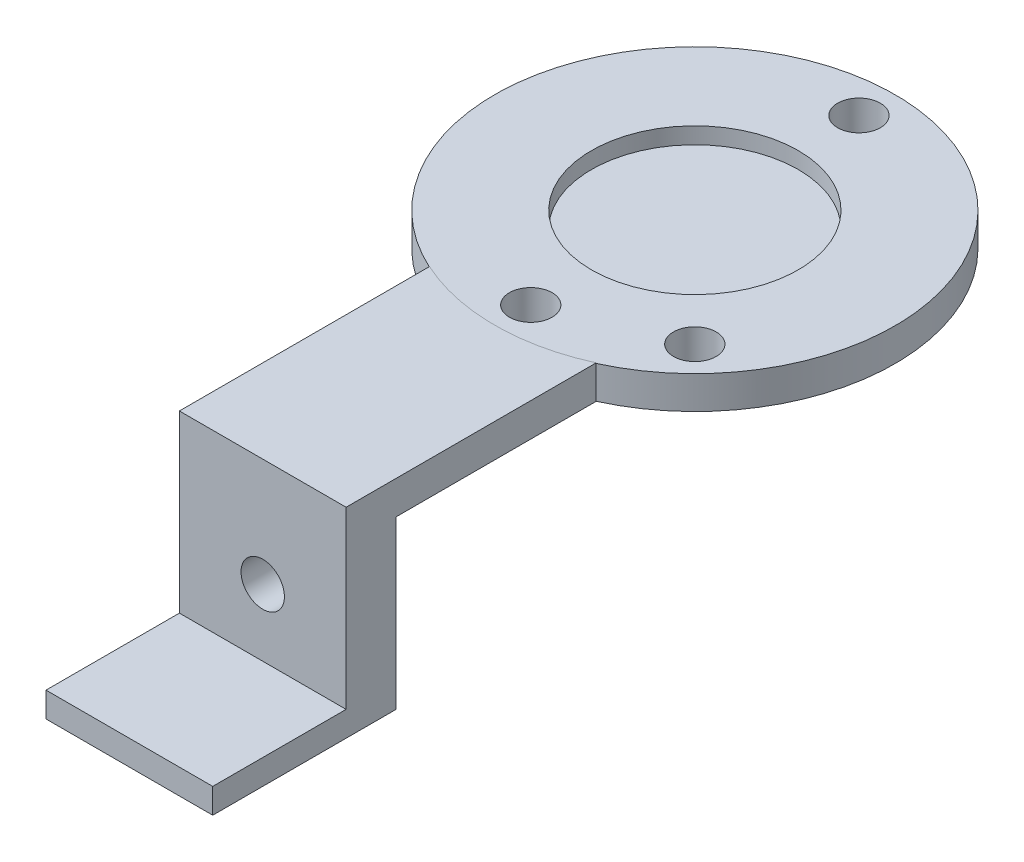
ISO-10303-21;
HEADER;
FILE_DESCRIPTION(('STEP AP214'),'2;1');
FILE_NAME('part.step','',(''),(''),'','','');
FILE_SCHEMA(('AUTOMOTIVE_DESIGN { 1 0 10303 214 1 1 1 1 }'));
ENDSEC;
DATA;
#1=APPLICATION_CONTEXT('core data for automotive mechanical design processes');
#2=APPLICATION_PROTOCOL_DEFINITION('international standard','automotive_design',2000,#1);
#3=PRODUCT_CONTEXT('',#1,'mechanical');
#4=PRODUCT('Part','Part','',(#3));
#5=PRODUCT_RELATED_PRODUCT_CATEGORY('part','',(#4));
#6=PRODUCT_DEFINITION_FORMATION('','',#4);
#7=PRODUCT_DEFINITION_CONTEXT('part definition',#1,'design');
#8=PRODUCT_DEFINITION('design','',#6,#7);
#9=PRODUCT_DEFINITION_SHAPE('','',#8);
#10=(LENGTH_UNIT() NAMED_UNIT(*) SI_UNIT(.MILLI.,.METRE.));
#11=(NAMED_UNIT(*) PLANE_ANGLE_UNIT() SI_UNIT($,.RADIAN.));
#12=(NAMED_UNIT(*) SI_UNIT($,.STERADIAN.) SOLID_ANGLE_UNIT());
#13=UNCERTAINTY_MEASURE_WITH_UNIT(LENGTH_MEASURE(1.E-05),#10,'distance_accuracy_value','');
#14=(GEOMETRIC_REPRESENTATION_CONTEXT(3) GLOBAL_UNCERTAINTY_ASSIGNED_CONTEXT((#13)) GLOBAL_UNIT_ASSIGNED_CONTEXT((#10,
#11,#12)) REPRESENTATION_CONTEXT('',''));
#15=CARTESIAN_POINT('',(0.,0.,0.));
#16=DIRECTION('',(0.,0.,1.));
#17=DIRECTION('',(1.,0.,0.));
#18=AXIS2_PLACEMENT_3D('',#15,#16,#17);
#19=CARTESIAN_POINT('',(0.,-11.43,65.8301280198992));
#20=DIRECTION('',(0.,0.,-1.));
#21=DIRECTION('',(-1.,0.,0.));
#22=AXIS2_PLACEMENT_3D('',#19,#20,#21);
#23=CYLINDRICAL_SURFACE('',#22,3.302);
#24=CARTESIAN_POINT('',(0.,-11.43,65.8301280198992));
#25=DIRECTION('',(0.,0.,-1.));
#26=DIRECTION('',(-1.,0.,0.));
#27=AXIS2_PLACEMENT_3D('',#24,#25,#26);
#28=CIRCLE('',#27,3.302);
#29=CARTESIAN_POINT('',(-3.302,-11.43,65.8301280198992));
#30=VERTEX_POINT('',#29);
#31=EDGE_CURVE('E304',#30,#30,#28,.T.);
#32=CARTESIAN_POINT('',(0.,-11.43,60.7501280198992));
#33=DIRECTION('',(0.,0.,-1.));
#34=DIRECTION('',(-1.,0.,0.));
#35=AXIS2_PLACEMENT_3D('',#32,#33,#34);
#36=CIRCLE('',#35,3.302);
#37=CARTESIAN_POINT('',(-3.302,-11.43,60.7501280198992));
#38=VERTEX_POINT('',#37);
#39=EDGE_CURVE('E39',#38,#38,#36,.F.);
#40=CARTESIAN_POINT('',(-3.302,-11.43,65.8301280198992));
#41=CARTESIAN_POINT('',(-3.302,-11.43,65.7772113532326));
#42=CARTESIAN_POINT('',(-3.302,-11.43,65.7242946865659));
#43=CARTESIAN_POINT('',(-3.302,-11.43,65.6184613532326));
#44=CARTESIAN_POINT('',(-3.302,-11.43,65.5655446865659));
#45=CARTESIAN_POINT('',(-3.302,-11.43,65.4597113532326));
#46=CARTESIAN_POINT('',(-3.302,-11.43,65.4067946865659));
#47=CARTESIAN_POINT('',(-3.302,-11.43,65.3009613532326));
#48=CARTESIAN_POINT('',(-3.302,-11.43,65.2480446865659));
#49=CARTESIAN_POINT('',(-3.302,-11.43,65.1422113532326));
#50=CARTESIAN_POINT('',(-3.302,-11.43,65.0892946865659));
#51=CARTESIAN_POINT('',(-3.302,-11.43,64.9834613532326));
#52=CARTESIAN_POINT('',(-3.302,-11.43,64.9305446865659));
#53=CARTESIAN_POINT('',(-3.302,-11.43,64.8247113532326));
#54=CARTESIAN_POINT('',(-3.302,-11.43,64.7717946865659));
#55=CARTESIAN_POINT('',(-3.302,-11.43,64.6659613532326));
#56=CARTESIAN_POINT('',(-3.302,-11.43,64.6130446865659));
#57=CARTESIAN_POINT('',(-3.302,-11.43,64.5072113532326));
#58=CARTESIAN_POINT('',(-3.302,-11.43,64.4542946865659));
#59=CARTESIAN_POINT('',(-3.302,-11.43,64.3484613532326));
#60=CARTESIAN_POINT('',(-3.302,-11.43,64.2955446865659));
#61=CARTESIAN_POINT('',(-3.302,-11.43,64.1897113532326));
#62=CARTESIAN_POINT('',(-3.302,-11.43,64.1367946865659));
#63=CARTESIAN_POINT('',(-3.302,-11.43,64.0309613532326));
#64=CARTESIAN_POINT('',(-3.302,-11.43,63.9780446865659));
#65=CARTESIAN_POINT('',(-3.302,-11.43,63.8722113532326));
#66=CARTESIAN_POINT('',(-3.302,-11.43,63.8192946865659));
#67=CARTESIAN_POINT('',(-3.302,-11.43,63.7134613532326));
#68=CARTESIAN_POINT('',(-3.302,-11.43,63.6605446865659));
#69=CARTESIAN_POINT('',(-3.302,-11.43,63.5547113532326));
#70=CARTESIAN_POINT('',(-3.302,-11.43,63.5017946865659));
#71=CARTESIAN_POINT('',(-3.302,-11.43,63.3959613532326));
#72=CARTESIAN_POINT('',(-3.302,-11.43,63.3430446865659));
#73=CARTESIAN_POINT('',(-3.302,-11.43,63.2372113532326));
#74=CARTESIAN_POINT('',(-3.302,-11.43,63.1842946865659));
#75=CARTESIAN_POINT('',(-3.302,-11.43,63.0784613532326));
#76=CARTESIAN_POINT('',(-3.302,-11.43,63.0255446865659));
#77=CARTESIAN_POINT('',(-3.302,-11.43,62.9197113532326));
#78=CARTESIAN_POINT('',(-3.302,-11.43,62.8667946865659));
#79=CARTESIAN_POINT('',(-3.302,-11.43,62.7609613532326));
#80=CARTESIAN_POINT('',(-3.302,-11.43,62.7080446865659));
#81=CARTESIAN_POINT('',(-3.302,-11.43,62.6022113532326));
#82=CARTESIAN_POINT('',(-3.302,-11.43,62.5492946865659));
#83=CARTESIAN_POINT('',(-3.302,-11.43,62.4434613532326));
#84=CARTESIAN_POINT('',(-3.302,-11.43,62.3905446865659));
#85=CARTESIAN_POINT('',(-3.302,-11.43,62.2847113532326));
#86=CARTESIAN_POINT('',(-3.302,-11.43,62.2317946865659));
#87=CARTESIAN_POINT('',(-3.302,-11.43,62.1259613532326));
#88=CARTESIAN_POINT('',(-3.302,-11.43,62.0730446865659));
#89=CARTESIAN_POINT('',(-3.302,-11.43,61.9672113532326));
#90=CARTESIAN_POINT('',(-3.302,-11.43,61.9142946865659));
#91=CARTESIAN_POINT('',(-3.302,-11.43,61.8084613532326));
#92=CARTESIAN_POINT('',(-3.302,-11.43,61.7555446865659));
#93=CARTESIAN_POINT('',(-3.302,-11.43,61.6497113532326));
#94=CARTESIAN_POINT('',(-3.302,-11.43,61.5967946865659));
#95=CARTESIAN_POINT('',(-3.302,-11.43,61.4909613532326));
#96=CARTESIAN_POINT('',(-3.302,-11.43,61.4380446865659));
#97=CARTESIAN_POINT('',(-3.302,-11.43,61.3322113532326));
#98=CARTESIAN_POINT('',(-3.302,-11.43,61.2792946865659));
#99=CARTESIAN_POINT('',(-3.302,-11.43,61.1734613532326));
#100=CARTESIAN_POINT('',(-3.302,-11.43,61.1205446865659));
#101=CARTESIAN_POINT('',(-3.302,-11.43,61.0147113532326));
#102=CARTESIAN_POINT('',(-3.302,-11.43,60.9617946865659));
#103=CARTESIAN_POINT('',(-3.302,-11.43,60.8559613532326));
#104=CARTESIAN_POINT('',(-3.302,-11.43,60.8030446865659));
#105=CARTESIAN_POINT('',(-3.302,-11.43,60.7501280198992));
#106=B_SPLINE_CURVE_WITH_KNOTS('',3,(#40,#41,#42,#43,#44,#45,#46,#47,#48,#49,#50,#51,#52,#53,
#54,#55,#56,#57,#58,#59,#60,#61,#62,#63,#64,#65,#66,#67,#68,#69,#70,#71,#72,#73,#74,#75,#76,#77,
#78,#79,#80,#81,#82,#83,#84,#85,#86,#87,#88,#89,#90,#91,#92,#93,#94,#95,#96,#97,#98,#99,#100,
#101,#102,#103,#104,#105),.UNSPECIFIED.,.F.,.F.,(4,2,2,2,2,2,2,2,2,2,2,2,2,2,2,2,2,2,2,2,2,2,2,
2,2,2,2,2,2,2,2,2,4),(0.,0.158750000000013,0.317500000000012,0.476250000000011,
0.635000000000011,0.79375000000001,0.952500000000009,1.11125000000001,1.27000000000001,
1.42875000000001,1.58750000000001,1.74625,1.905,2.06375,2.2225,2.38125000000002,
2.54000000000001,2.69875000000001,2.85750000000001,3.01625000000001,3.17500000000001,
3.33375000000001,3.49250000000001,3.65125000000001,3.81000000000001,3.96875000000001,
4.12750000000001,4.28625000000001,4.44500000000001,4.60375000000001,4.76250000000001,
4.92125000000001,5.08000000000001),.UNSPECIFIED.);
#107=EDGE_CURVE('BSEAM35',#30,#38,#106,.T.);
#108=ORIENTED_EDGE('',*,*,#31,.F.);
#109=ORIENTED_EDGE('',*,*,#39,.F.);
#110=ORIENTED_EDGE('',*,*,#107,.T.);
#111=ORIENTED_EDGE('',*,*,#107,.F.);
#112=EDGE_LOOP('',(#108,#110,#109,#111));
#113=FACE_BOUND('',#112,.T.);
#114=ADVANCED_FACE('F35',(#113),#23,.F.);
#115=CARTESIAN_POINT('',(0.,0.,0.));
#116=DIRECTION('',(0.,1.,0.));
#117=DIRECTION('',(0.,0.,1.));
#118=AXIS2_PLACEMENT_3D('',#115,#116,#117);
#119=PLANE('',#118);
#120=CARTESIAN_POINT('',(0.,0.,0.));
#121=DIRECTION('',(0.,-1.,0.));
#122=DIRECTION('',(0.,0.,-1.));
#123=AXIS2_PLACEMENT_3D('',#120,#121,#122);
#124=CIRCLE('',#123,15.75);
#125=CARTESIAN_POINT('',(0.,0.,-15.75));
#126=VERTEX_POINT('',#125);
#127=EDGE_CURVE('E11',#126,#126,#124,.T.);
#128=ORIENTED_EDGE('',*,*,#127,.F.);
#129=EDGE_LOOP('',(#128));
#130=FACE_BOUND('',#129,.T.);
#131=CARTESIAN_POINT('',(0.,0.,-25.));
#132=DIRECTION('',(0.,-1.,0.));
#133=DIRECTION('',(0.,0.,-1.));
#134=AXIS2_PLACEMENT_3D('',#131,#132,#133);
#135=CIRCLE('',#134,3.25);
#136=CARTESIAN_POINT('',(0.,0.,-28.25));
#137=VERTEX_POINT('',#136);
#138=EDGE_CURVE('E189',#137,#137,#135,.T.);
#139=ORIENTED_EDGE('',*,*,#138,.F.);
#140=EDGE_LOOP('',(#139));
#141=FACE_BOUND('',#140,.T.);
#142=CARTESIAN_POINT('',(0.,0.,25.));
#143=DIRECTION('',(0.,-1.,0.));
#144=DIRECTION('',(0.,0.,-1.));
#145=AXIS2_PLACEMENT_3D('',#142,#143,#144);
#146=CIRCLE('',#145,3.25);
#147=CARTESIAN_POINT('',(0.,0.,21.75));
#148=VERTEX_POINT('',#147);
#149=EDGE_CURVE('E183',#148,#148,#146,.T.);
#150=ORIENTED_EDGE('',*,*,#149,.F.);
#151=EDGE_LOOP('',(#150));
#152=FACE_BOUND('',#151,.T.);
#153=CARTESIAN_POINT('',(17.6744764826842,0.,17.680862));
#154=DIRECTION('',(0.,-1.,0.));
#155=DIRECTION('',(0.,0.,-1.));
#156=AXIS2_PLACEMENT_3D('',#153,#154,#155);
#157=CIRCLE('',#156,3.25);
#158=CARTESIAN_POINT('',(17.6744764826842,0.,14.430862));
#159=VERTEX_POINT('',#158);
#160=EDGE_CURVE('E177',#159,#159,#157,.T.);
#161=ORIENTED_EDGE('',*,*,#160,.F.);
#162=EDGE_LOOP('',(#161));
#163=FACE_BOUND('',#162,.T.);
#164=DIRECTION('',(1.,0.,0.));
#165=VECTOR('',#164,1.);
#166=CARTESIAN_POINT('',(12.7,0.,58.2101280198992));
#167=LINE('',#166,#165);
#168=CARTESIAN_POINT('',(-12.7,0.,58.2101280198992));
#169=VERTEX_POINT('',#168);
#170=CARTESIAN_POINT('',(12.7,0.,58.2101280198992));
#171=VERTEX_POINT('',#170);
#172=EDGE_CURVE('E60',#169,#171,#167,.T.);
#173=ORIENTED_EDGE('',*,*,#172,.F.);
#174=DIRECTION('',(0.,0.,1.));
#175=VECTOR('',#174,1.);
#176=CARTESIAN_POINT('',(-12.7,0.,0.));
#177=LINE('',#176,#175);
#178=CARTESIAN_POINT('',(-12.7,0.,27.7301280198992));
#179=VERTEX_POINT('',#178);
#180=EDGE_CURVE('E151',#179,#169,#177,.T.);
#181=ORIENTED_EDGE('',*,*,#180,.F.);
#182=CARTESIAN_POINT('',(0.,0.,0.));
#183=DIRECTION('',(0.,1.,0.));
#184=DIRECTION('',(0.,0.,1.));
#185=AXIS2_PLACEMENT_3D('',#182,#183,#184);
#186=CIRCLE('',#185,30.5);
#187=CARTESIAN_POINT('',(12.7,0.,27.7301280198992));
#188=VERTEX_POINT('',#187);
#189=EDGE_CURVE('E202',#188,#179,#186,.T.);
#190=ORIENTED_EDGE('',*,*,#189,.F.);
#191=DIRECTION('',(0.,0.,1.));
#192=VECTOR('',#191,1.);
#193=CARTESIAN_POINT('',(12.7,0.,0.));
#194=LINE('',#193,#192);
#195=EDGE_CURVE('E155',#188,#171,#194,.T.);
#196=ORIENTED_EDGE('',*,*,#195,.T.);
#197=EDGE_LOOP('',(#173,#181,#190,#196));
#198=FACE_BOUND('',#197,.T.);
#199=ADVANCED_FACE('F216',(#130,#141,#152,#163,#198),#119,.F.);
#200=CARTESIAN_POINT('',(0.,5.,0.));
#201=DIRECTION('',(0.,-1.,0.));
#202=DIRECTION('',(0.,0.,-1.));
#203=AXIS2_PLACEMENT_3D('',#200,#201,#202);
#204=CYLINDRICAL_SURFACE('',#203,30.5);
#205=DIRECTION('',(0.,-1.,0.));
#206=VECTOR('',#205,1.);
#207=CARTESIAN_POINT('',(-12.7,5.08,27.7301280198992));
#208=LINE('',#207,#206);
#209=CARTESIAN_POINT('',(-12.7,5.,27.7301280198992));
#210=VERTEX_POINT('',#209);
#211=EDGE_CURVE('E162',#210,#179,#208,.T.);
#212=ORIENTED_EDGE('',*,*,#211,.F.);
#213=CARTESIAN_POINT('',(0.,5.,0.));
#214=DIRECTION('',(0.,1.,0.));
#215=DIRECTION('',(0.,0.,1.));
#216=AXIS2_PLACEMENT_3D('',#213,#214,#215);
#217=CIRCLE('',#216,30.5);
#218=CARTESIAN_POINT('',(12.7,5.,27.7301280198992));
#219=VERTEX_POINT('',#218);
#220=EDGE_CURVE('E44',#219,#210,#217,.T.);
#221=ORIENTED_EDGE('',*,*,#220,.F.);
#222=DIRECTION('',(0.,-1.,0.));
#223=VECTOR('',#222,1.);
#224=CARTESIAN_POINT('',(12.7,5.08,27.7301280198992));
#225=LINE('',#224,#223);
#226=EDGE_CURVE('E172',#219,#188,#225,.T.);
#227=ORIENTED_EDGE('',*,*,#226,.T.);
#228=ORIENTED_EDGE('',*,*,#189,.T.);
#229=EDGE_LOOP('',(#212,#221,#227,#228));
#230=FACE_BOUND('',#229,.T.);
#231=ADVANCED_FACE('F37',(#230),#204,.T.);
#232=CARTESIAN_POINT('',(0.,5.,0.));
#233=DIRECTION('',(0.,1.,0.));
#234=DIRECTION('',(0.,0.,1.));
#235=AXIS2_PLACEMENT_3D('',#232,#233,#234);
#236=PLANE('',#235);
#237=CARTESIAN_POINT('',(17.6744764826842,5.,17.680862));
#238=DIRECTION('',(0.,1.,0.));
#239=DIRECTION('',(0.,0.,1.));
#240=AXIS2_PLACEMENT_3D('',#237,#238,#239);
#241=CIRCLE('',#240,3.25);
#242=CARTESIAN_POINT('',(17.6744764826842,5.,20.930862));
#243=VERTEX_POINT('',#242);
#244=EDGE_CURVE('E180',#243,#243,#241,.T.);
#245=ORIENTED_EDGE('',*,*,#244,.F.);
#246=EDGE_LOOP('',(#245));
#247=FACE_BOUND('',#246,.T.);
#248=CARTESIAN_POINT('',(0.,5.,25.));
#249=DIRECTION('',(0.,1.,0.));
#250=DIRECTION('',(0.,0.,1.));
#251=AXIS2_PLACEMENT_3D('',#248,#249,#250);
#252=CIRCLE('',#251,3.25);
#253=CARTESIAN_POINT('',(0.,5.,28.25));
#254=VERTEX_POINT('',#253);
#255=EDGE_CURVE('E186',#254,#254,#252,.T.);
#256=ORIENTED_EDGE('',*,*,#255,.F.);
#257=EDGE_LOOP('',(#256));
#258=FACE_BOUND('',#257,.T.);
#259=CARTESIAN_POINT('',(0.,5.,-25.));
#260=DIRECTION('',(0.,1.,0.));
#261=DIRECTION('',(0.,0.,1.));
#262=AXIS2_PLACEMENT_3D('',#259,#260,#261);
#263=CIRCLE('',#262,3.25);
#264=CARTESIAN_POINT('',(0.,5.,-21.75));
#265=VERTEX_POINT('',#264);
#266=EDGE_CURVE('E192',#265,#265,#263,.T.);
#267=ORIENTED_EDGE('',*,*,#266,.F.);
#268=EDGE_LOOP('',(#267));
#269=FACE_BOUND('',#268,.T.);
#270=CARTESIAN_POINT('',(0.,5.,0.));
#271=DIRECTION('',(0.,1.,0.));
#272=DIRECTION('',(0.,0.,1.));
#273=AXIS2_PLACEMENT_3D('',#270,#271,#272);
#274=CIRCLE('',#273,15.75);
#275=CARTESIAN_POINT('',(0.,5.,15.75));
#276=VERTEX_POINT('',#275);
#277=EDGE_CURVE('E197',#276,#276,#274,.T.);
#278=ORIENTED_EDGE('',*,*,#277,.F.);
#279=EDGE_LOOP('',(#278));
#280=FACE_BOUND('',#279,.T.);
#281=ORIENTED_EDGE('',*,*,#220,.T.);
#282=CARTESIAN_POINT('',(0.,5.,0.));
#283=DIRECTION('',(0.,1.,0.));
#284=DIRECTION('',(0.,0.,1.));
#285=AXIS2_PLACEMENT_3D('',#282,#283,#284);
#286=CIRCLE('',#285,30.5);
#287=EDGE_CURVE('E167',#210,#219,#286,.T.);
#288=ORIENTED_EDGE('',*,*,#287,.T.);
#289=EDGE_LOOP('',(#281,#288));
#290=FACE_BOUND('',#289,.T.);
#291=ADVANCED_FACE('F223',(#247,#258,#269,#280,#290),#236,.T.);
#292=CARTESIAN_POINT('',(0.,2.5,0.));
#293=DIRECTION('',(0.,1.,0.));
#294=DIRECTION('',(0.,0.,1.));
#295=AXIS2_PLACEMENT_3D('',#292,#293,#294);
#296=CYLINDRICAL_SURFACE('',#295,15.75);
#297=CARTESIAN_POINT('',(0.,2.5,0.));
#298=DIRECTION('',(0.,1.,0.));
#299=DIRECTION('',(0.,0.,1.));
#300=AXIS2_PLACEMENT_3D('',#297,#298,#299);
#301=CIRCLE('',#300,15.75);
#302=CARTESIAN_POINT('',(0.,2.5,15.75));
#303=VERTEX_POINT('',#302);
#304=EDGE_CURVE('E199',#303,#303,#301,.T.);
#305=ORIENTED_EDGE('',*,*,#304,.F.);
#306=EDGE_LOOP('',(#305));
#307=FACE_BOUND('',#306,.T.);
#308=ORIENTED_EDGE('',*,*,#277,.T.);
#309=EDGE_LOOP('',(#308));
#310=FACE_BOUND('',#309,.T.);
#311=ADVANCED_FACE('F231',(#307,#310),#296,.F.);
#312=CARTESIAN_POINT('',(0.,2.5,0.));
#313=DIRECTION('',(0.,1.,0.));
#314=DIRECTION('',(0.,0.,1.));
#315=AXIS2_PLACEMENT_3D('',#312,#313,#314);
#316=PLANE('',#315);
#317=ORIENTED_EDGE('',*,*,#304,.T.);
#318=EDGE_LOOP('',(#317));
#319=FACE_BOUND('',#318,.T.);
#320=ADVANCED_FACE('F235',(#319),#316,.T.);
#321=CARTESIAN_POINT('',(0.,-2.5,0.));
#322=DIRECTION('',(0.,1.,0.));
#323=DIRECTION('',(0.,0.,1.));
#324=AXIS2_PLACEMENT_3D('',#321,#322,#323);
#325=CYLINDRICAL_SURFACE('',#324,15.75);
#326=CARTESIAN_POINT('',(0.,-2.5,0.));
#327=DIRECTION('',(0.,-1.,0.));
#328=DIRECTION('',(0.,0.,-1.));
#329=AXIS2_PLACEMENT_3D('',#326,#327,#328);
#330=CIRCLE('',#329,15.75);
#331=CARTESIAN_POINT('',(0.,-2.5,-15.75));
#332=VERTEX_POINT('',#331);
#333=EDGE_CURVE('E195',#332,#332,#330,.T.);
#334=ORIENTED_EDGE('',*,*,#333,.F.);
#335=EDGE_LOOP('',(#334));
#336=FACE_BOUND('',#335,.T.);
#337=ORIENTED_EDGE('',*,*,#127,.T.);
#338=EDGE_LOOP('',(#337));
#339=FACE_BOUND('',#338,.T.);
#340=ADVANCED_FACE('F239',(#336,#339),#325,.T.);
#341=CARTESIAN_POINT('',(0.,-2.5,0.));
#342=DIRECTION('',(0.,-1.,0.));
#343=DIRECTION('',(0.,0.,-1.));
#344=AXIS2_PLACEMENT_3D('',#341,#342,#343);
#345=PLANE('',#344);
#346=ORIENTED_EDGE('',*,*,#333,.T.);
#347=EDGE_LOOP('',(#346));
#348=FACE_BOUND('',#347,.T.);
#349=ADVANCED_FACE('F243',(#348),#345,.T.);
#350=CARTESIAN_POINT('',(0.,5.08,-25.));
#351=DIRECTION('',(0.,-1.,0.));
#352=DIRECTION('',(0.,0.,-1.));
#353=AXIS2_PLACEMENT_3D('',#350,#351,#352);
#354=CYLINDRICAL_SURFACE('',#353,3.25);
#355=ORIENTED_EDGE('',*,*,#266,.T.);
#356=EDGE_LOOP('',(#355));
#357=FACE_BOUND('',#356,.T.);
#358=ORIENTED_EDGE('',*,*,#138,.T.);
#359=EDGE_LOOP('',(#358));
#360=FACE_BOUND('',#359,.T.);
#361=ADVANCED_FACE('F247',(#357,#360),#354,.F.);
#362=CARTESIAN_POINT('',(0.,5.08,25.));
#363=DIRECTION('',(0.,-1.,0.));
#364=DIRECTION('',(0.,0.,-1.));
#365=AXIS2_PLACEMENT_3D('',#362,#363,#364);
#366=CYLINDRICAL_SURFACE('',#365,3.25);
#367=ORIENTED_EDGE('',*,*,#255,.T.);
#368=EDGE_LOOP('',(#367));
#369=FACE_BOUND('',#368,.T.);
#370=ORIENTED_EDGE('',*,*,#149,.T.);
#371=EDGE_LOOP('',(#370));
#372=FACE_BOUND('',#371,.T.);
#373=ADVANCED_FACE('F251',(#369,#372),#366,.F.);
#374=CARTESIAN_POINT('',(17.6744764826842,5.08,17.680862));
#375=DIRECTION('',(0.,-1.,0.));
#376=DIRECTION('',(0.,0.,-1.));
#377=AXIS2_PLACEMENT_3D('',#374,#375,#376);
#378=CYLINDRICAL_SURFACE('',#377,3.25);
#379=ORIENTED_EDGE('',*,*,#244,.T.);
#380=EDGE_LOOP('',(#379));
#381=FACE_BOUND('',#380,.T.);
#382=ORIENTED_EDGE('',*,*,#160,.T.);
#383=EDGE_LOOP('',(#382));
#384=FACE_BOUND('',#383,.T.);
#385=ADVANCED_FACE('F255',(#381,#384),#378,.F.);
#386=CARTESIAN_POINT('',(-12.7,5.08,0.));
#387=DIRECTION('',(1.,0.,0.));
#388=DIRECTION('',(0.,0.,-1.));
#389=AXIS2_PLACEMENT_3D('',#386,#387,#388);
#390=PLANE('',#389);
#391=ORIENTED_EDGE('',*,*,#180,.T.);
#392=DIRECTION('',(0.,1.,0.));
#393=VECTOR('',#392,1.);
#394=CARTESIAN_POINT('',(-12.7,-25.4,58.2101280198992));
#395=LINE('',#394,#393);
#396=CARTESIAN_POINT('',(-12.7,-25.4,58.2101280198992));
#397=VERTEX_POINT('',#396);
#398=EDGE_CURVE('E148',#397,#169,#395,.T.);
#399=ORIENTED_EDGE('',*,*,#398,.F.);
#400=DIRECTION('',(0.,0.,-1.));
#401=VECTOR('',#400,1.);
#402=CARTESIAN_POINT('',(-12.7,-25.4,58.2101280198992));
#403=LINE('',#402,#401);
#404=CARTESIAN_POINT('',(-12.7,-25.4,86.1501280198992));
#405=VERTEX_POINT('',#404);
#406=EDGE_CURVE('E141',#405,#397,#403,.T.);
#407=ORIENTED_EDGE('',*,*,#406,.F.);
#408=DIRECTION('',(0.,-1.,0.));
#409=VECTOR('',#408,1.);
#410=CARTESIAN_POINT('',(-12.7,-25.4,86.1501280198992));
#411=LINE('',#410,#409);
#412=CARTESIAN_POINT('',(-12.7,-21.59,86.1501280198992));
#413=VERTEX_POINT('',#412);
#414=EDGE_CURVE('E119',#413,#405,#411,.T.);
#415=ORIENTED_EDGE('',*,*,#414,.F.);
#416=DIRECTION('',(0.,0.,-1.));
#417=VECTOR('',#416,1.);
#418=CARTESIAN_POINT('',(-12.7,-21.59,86.1501280198992));
#419=LINE('',#418,#417);
#420=CARTESIAN_POINT('',(-12.7,-21.59,65.8301280198992));
#421=VERTEX_POINT('',#420);
#422=EDGE_CURVE('E115',#413,#421,#419,.T.);
#423=ORIENTED_EDGE('',*,*,#422,.T.);
#424=DIRECTION('',(0.,-1.,0.));
#425=VECTOR('',#424,1.);
#426=CARTESIAN_POINT('',(-12.7,5.08,65.8301280198992));
#427=LINE('',#426,#425);
#428=CARTESIAN_POINT('',(-12.7,5.08,65.8301280198992));
#429=VERTEX_POINT('',#428);
#430=EDGE_CURVE('E165',#429,#421,#427,.T.);
#431=ORIENTED_EDGE('',*,*,#430,.F.);
#432=DIRECTION('',(0.,0.,1.));
#433=VECTOR('',#432,1.);
#434=CARTESIAN_POINT('',(-12.7,5.08,0.));
#435=LINE('',#434,#433);
#436=CARTESIAN_POINT('',(-12.7,5.08,27.7301280198992));
#437=VERTEX_POINT('',#436);
#438=EDGE_CURVE('E152',#437,#429,#435,.T.);
#439=ORIENTED_EDGE('',*,*,#438,.F.);
#440=EDGE_CURVE('E173',#437,#210,#208,.T.);
#441=ORIENTED_EDGE('',*,*,#440,.T.);
#442=ORIENTED_EDGE('',*,*,#211,.T.);
#443=EDGE_LOOP('',(#391,#399,#407,#415,#423,#431,#439,#441,#442));
#444=FACE_BOUND('',#443,.T.);
#445=ADVANCED_FACE('F212',(#444),#390,.F.);
#446=CARTESIAN_POINT('',(0.,5.08,65.8301280198992));
#447=DIRECTION('',(0.,0.,1.));
#448=DIRECTION('',(1.,0.,0.));
#449=AXIS2_PLACEMENT_3D('',#446,#447,#448);
#450=PLANE('',#449);
#451=ORIENTED_EDGE('',*,*,#31,.T.);
#452=EDGE_LOOP('',(#451));
#453=FACE_BOUND('',#452,.T.);
#454=DIRECTION('',(-1.,0.,0.));
#455=VECTOR('',#454,1.);
#456=CARTESIAN_POINT('',(12.7,-21.59,65.8301280198992));
#457=LINE('',#456,#455);
#458=CARTESIAN_POINT('',(12.7,-21.59,65.8301280198992));
#459=VERTEX_POINT('',#458);
#460=EDGE_CURVE('E52',#459,#421,#457,.T.);
#461=ORIENTED_EDGE('',*,*,#460,.F.);
#462=DIRECTION('',(0.,-1.,0.));
#463=VECTOR('',#462,1.);
#464=CARTESIAN_POINT('',(12.7,5.08,65.8301280198992));
#465=LINE('',#464,#463);
#466=CARTESIAN_POINT('',(12.7,5.08,65.8301280198992));
#467=VERTEX_POINT('',#466);
#468=EDGE_CURVE('E133',#467,#459,#465,.T.);
#469=ORIENTED_EDGE('',*,*,#468,.F.);
#470=DIRECTION('',(-1.,0.,0.));
#471=VECTOR('',#470,1.);
#472=CARTESIAN_POINT('',(0.,5.08,65.8301280198992));
#473=LINE('',#472,#471);
#474=EDGE_CURVE('E159',#467,#429,#473,.T.);
#475=ORIENTED_EDGE('',*,*,#474,.T.);
#476=ORIENTED_EDGE('',*,*,#430,.T.);
#477=EDGE_LOOP('',(#461,#469,#475,#476));
#478=FACE_BOUND('',#477,.T.);
#479=ADVANCED_FACE('F262',(#453,#478),#450,.T.);
#480=CARTESIAN_POINT('',(12.7,5.08,0.));
#481=DIRECTION('',(1.,0.,0.));
#482=DIRECTION('',(0.,0.,-1.));
#483=AXIS2_PLACEMENT_3D('',#480,#481,#482);
#484=PLANE('',#483);
#485=ORIENTED_EDGE('',*,*,#195,.F.);
#486=ORIENTED_EDGE('',*,*,#226,.F.);
#487=CARTESIAN_POINT('',(12.7,5.08,27.7301280198992));
#488=VERTEX_POINT('',#487);
#489=EDGE_CURVE('E169',#488,#219,#225,.T.);
#490=ORIENTED_EDGE('',*,*,#489,.F.);
#491=DIRECTION('',(0.,0.,1.));
#492=VECTOR('',#491,1.);
#493=CARTESIAN_POINT('',(12.7,5.08,0.));
#494=LINE('',#493,#492);
#495=EDGE_CURVE('E157',#488,#467,#494,.T.);
#496=ORIENTED_EDGE('',*,*,#495,.T.);
#497=ORIENTED_EDGE('',*,*,#468,.T.);
#498=DIRECTION('',(0.,0.,-1.));
#499=VECTOR('',#498,1.);
#500=CARTESIAN_POINT('',(12.7,-21.59,86.1501280198992));
#501=LINE('',#500,#499);
#502=CARTESIAN_POINT('',(12.7,-21.59,86.1501280198992));
#503=VERTEX_POINT('',#502);
#504=EDGE_CURVE('E113',#503,#459,#501,.T.);
#505=ORIENTED_EDGE('',*,*,#504,.F.);
#506=DIRECTION('',(0.,1.,0.));
#507=VECTOR('',#506,1.);
#508=CARTESIAN_POINT('',(12.7,-25.4,86.1501280198992));
#509=LINE('',#508,#507);
#510=CARTESIAN_POINT('',(12.7,-25.4,86.1501280198992));
#511=VERTEX_POINT('',#510);
#512=EDGE_CURVE('E120',#511,#503,#509,.T.);
#513=ORIENTED_EDGE('',*,*,#512,.F.);
#514=DIRECTION('',(0.,0.,1.));
#515=VECTOR('',#514,1.);
#516=CARTESIAN_POINT('',(12.7,-25.4,58.2101280198992));
#517=LINE('',#516,#515);
#518=CARTESIAN_POINT('',(12.7,-25.4,58.2101280198992));
#519=VERTEX_POINT('',#518);
#520=EDGE_CURVE('E135',#519,#511,#517,.T.);
#521=ORIENTED_EDGE('',*,*,#520,.F.);
#522=DIRECTION('',(0.,1.,0.));
#523=VECTOR('',#522,1.);
#524=CARTESIAN_POINT('',(12.7,-25.4,58.2101280198992));
#525=LINE('',#524,#523);
#526=EDGE_CURVE('E144',#519,#171,#525,.T.);
#527=ORIENTED_EDGE('',*,*,#526,.T.);
#528=EDGE_LOOP('',(#485,#486,#490,#496,#497,#505,#513,#521,#527));
#529=FACE_BOUND('',#528,.T.);
#530=ADVANCED_FACE('F131',(#529),#484,.T.);
#531=CARTESIAN_POINT('',(0.,5.08,0.));
#532=DIRECTION('',(0.,-1.,0.));
#533=DIRECTION('',(0.,0.,-1.));
#534=AXIS2_PLACEMENT_3D('',#531,#532,#533);
#535=CYLINDRICAL_SURFACE('',#534,30.5);
#536=ORIENTED_EDGE('',*,*,#287,.F.);
#537=ORIENTED_EDGE('',*,*,#440,.F.);
#538=CARTESIAN_POINT('',(0.,5.08,0.));
#539=DIRECTION('',(0.,-1.,0.));
#540=DIRECTION('',(0.,0.,-1.));
#541=AXIS2_PLACEMENT_3D('',#538,#539,#540);
#542=CIRCLE('',#541,30.5);
#543=EDGE_CURVE('E154',#488,#437,#542,.T.);
#544=ORIENTED_EDGE('',*,*,#543,.F.);
#545=ORIENTED_EDGE('',*,*,#489,.T.);
#546=EDGE_LOOP('',(#536,#537,#544,#545));
#547=FACE_BOUND('',#546,.T.);
#548=ADVANCED_FACE('F263',(#547),#535,.F.);
#549=CARTESIAN_POINT('',(0.,5.08,0.));
#550=DIRECTION('',(0.,-1.,0.));
#551=DIRECTION('',(0.,0.,-1.));
#552=AXIS2_PLACEMENT_3D('',#549,#550,#551);
#553=PLANE('',#552);
#554=ORIENTED_EDGE('',*,*,#438,.T.);
#555=ORIENTED_EDGE('',*,*,#474,.F.);
#556=ORIENTED_EDGE('',*,*,#495,.F.);
#557=ORIENTED_EDGE('',*,*,#543,.T.);
#558=EDGE_LOOP('',(#554,#555,#556,#557));
#559=FACE_BOUND('',#558,.T.);
#560=ADVANCED_FACE('F266',(#559),#553,.F.);
#561=CARTESIAN_POINT('',(12.7,-25.4,58.2101280198992));
#562=DIRECTION('',(0.,0.,1.));
#563=DIRECTION('',(1.,0.,0.));
#564=AXIS2_PLACEMENT_3D('',#561,#562,#563);
#565=PLANE('',#564);
#566=CARTESIAN_POINT('',(0.,-11.43,58.2101280198992));
#567=DIRECTION('',(0.,0.,-1.));
#568=DIRECTION('',(-1.,0.,0.));
#569=AXIS2_PLACEMENT_3D('',#566,#567,#568);
#570=CIRCLE('',#569,4.826);
#571=CARTESIAN_POINT('',(-4.826,-11.43,58.2101280198992));
#572=VERTEX_POINT('',#571);
#573=EDGE_CURVE('E307',#572,#572,#570,.T.);
#574=ORIENTED_EDGE('',*,*,#573,.F.);
#575=EDGE_LOOP('',(#574));
#576=FACE_BOUND('',#575,.T.);
#577=ORIENTED_EDGE('',*,*,#172,.T.);
#578=ORIENTED_EDGE('',*,*,#526,.F.);
#579=DIRECTION('',(1.,0.,0.));
#580=VECTOR('',#579,1.);
#581=CARTESIAN_POINT('',(12.7,-25.4,58.2101280198992));
#582=LINE('',#581,#580);
#583=EDGE_CURVE('E143',#397,#519,#582,.T.);
#584=ORIENTED_EDGE('',*,*,#583,.F.);
#585=ORIENTED_EDGE('',*,*,#398,.T.);
#586=EDGE_LOOP('',(#577,#578,#584,#585));
#587=FACE_BOUND('',#586,.T.);
#588=ADVANCED_FACE('F275',(#576,#587),#565,.F.);
#589=CARTESIAN_POINT('',(0.,-25.4,0.));
#590=DIRECTION('',(0.,-1.,0.));
#591=DIRECTION('',(0.,0.,-1.));
#592=AXIS2_PLACEMENT_3D('',#589,#590,#591);
#593=PLANE('',#592);
#594=ORIENTED_EDGE('',*,*,#520,.T.);
#595=DIRECTION('',(1.,0.,0.));
#596=VECTOR('',#595,1.);
#597=CARTESIAN_POINT('',(12.7,-25.4,86.1501280198992));
#598=LINE('',#597,#596);
#599=EDGE_CURVE('E126',#405,#511,#598,.T.);
#600=ORIENTED_EDGE('',*,*,#599,.F.);
#601=ORIENTED_EDGE('',*,*,#406,.T.);
#602=ORIENTED_EDGE('',*,*,#583,.T.);
#603=EDGE_LOOP('',(#594,#600,#601,#602));
#604=FACE_BOUND('',#603,.T.);
#605=ADVANCED_FACE('F279',(#604),#593,.T.);
#606=CARTESIAN_POINT('',(12.7,-21.59,86.1501280198992));
#607=DIRECTION('',(0.,-1.,0.));
#608=DIRECTION('',(0.,0.,-1.));
#609=AXIS2_PLACEMENT_3D('',#606,#607,#608);
#610=PLANE('',#609);
#611=ORIENTED_EDGE('',*,*,#460,.T.);
#612=ORIENTED_EDGE('',*,*,#422,.F.);
#613=DIRECTION('',(-1.,0.,0.));
#614=VECTOR('',#613,1.);
#615=CARTESIAN_POINT('',(12.7,-21.59,86.1501280198992));
#616=LINE('',#615,#614);
#617=EDGE_CURVE('E109',#503,#413,#616,.T.);
#618=ORIENTED_EDGE('',*,*,#617,.F.);
#619=ORIENTED_EDGE('',*,*,#504,.T.);
#620=EDGE_LOOP('',(#611,#612,#618,#619));
#621=FACE_BOUND('',#620,.T.);
#622=ADVANCED_FACE('F111',(#621),#610,.F.);
#623=CARTESIAN_POINT('',(0.,0.,86.1501280198992));
#624=DIRECTION('',(0.,0.,1.));
#625=DIRECTION('',(1.,0.,0.));
#626=AXIS2_PLACEMENT_3D('',#623,#624,#625);
#627=PLANE('',#626);
#628=ORIENTED_EDGE('',*,*,#512,.T.);
#629=ORIENTED_EDGE('',*,*,#617,.T.);
#630=ORIENTED_EDGE('',*,*,#414,.T.);
#631=ORIENTED_EDGE('',*,*,#599,.T.);
#632=EDGE_LOOP('',(#628,#629,#630,#631));
#633=FACE_BOUND('',#632,.T.);
#634=ADVANCED_FACE('F124',(#633),#627,.T.);
#635=CARTESIAN_POINT('',(0.,-11.43,60.7501280198992));
#636=DIRECTION('',(0.,0.,-1.));
#637=DIRECTION('',(-1.,0.,0.));
#638=AXIS2_PLACEMENT_3D('',#635,#636,#637);
#639=PLANE('',#638);
#640=CARTESIAN_POINT('',(0.,-11.43,60.7501280198992));
#641=DIRECTION('',(0.,0.,-1.));
#642=DIRECTION('',(-1.,0.,0.));
#643=AXIS2_PLACEMENT_3D('',#640,#641,#642);
#644=CIRCLE('',#643,4.826);
#645=CARTESIAN_POINT('',(-4.826,-11.43,60.7501280198992));
#646=VERTEX_POINT('',#645);
#647=EDGE_CURVE('E300',#646,#646,#644,.T.);
#648=ORIENTED_EDGE('',*,*,#647,.T.);
#649=EDGE_LOOP('',(#648));
#650=FACE_BOUND('',#649,.T.);
#651=ORIENTED_EDGE('',*,*,#39,.T.);
#652=EDGE_LOOP('',(#651));
#653=FACE_BOUND('',#652,.T.);
#654=ADVANCED_FACE('F287',(#650,#653),#639,.T.);
#655=CARTESIAN_POINT('',(0.,-11.43,60.7501280198992));
#656=DIRECTION('',(0.,0.,-1.));
#657=DIRECTION('',(-1.,0.,0.));
#658=AXIS2_PLACEMENT_3D('',#655,#656,#657);
#659=CYLINDRICAL_SURFACE('',#658,4.826);
#660=ORIENTED_EDGE('',*,*,#647,.F.);
#661=EDGE_LOOP('',(#660));
#662=FACE_BOUND('',#661,.T.);
#663=ORIENTED_EDGE('',*,*,#573,.T.);
#664=EDGE_LOOP('',(#663));
#665=FACE_BOUND('',#664,.T.);
#666=ADVANCED_FACE('F289',(#662,#665),#659,.F.);
#667=CLOSED_SHELL('',(#114,#199,#231,#291,#311,#320,#340,#349,#361,#373,#385,#445,#479,#530,
#548,#560,#588,#605,#622,#634,#654,#666));
#668=MANIFOLD_SOLID_BREP('B2',#667);
#669=ADVANCED_BREP_SHAPE_REPRESENTATION('',(#18,#668),#14);
#670=SHAPE_DEFINITION_REPRESENTATION(#9,#669);
ENDSEC;
END-ISO-10303-21;
